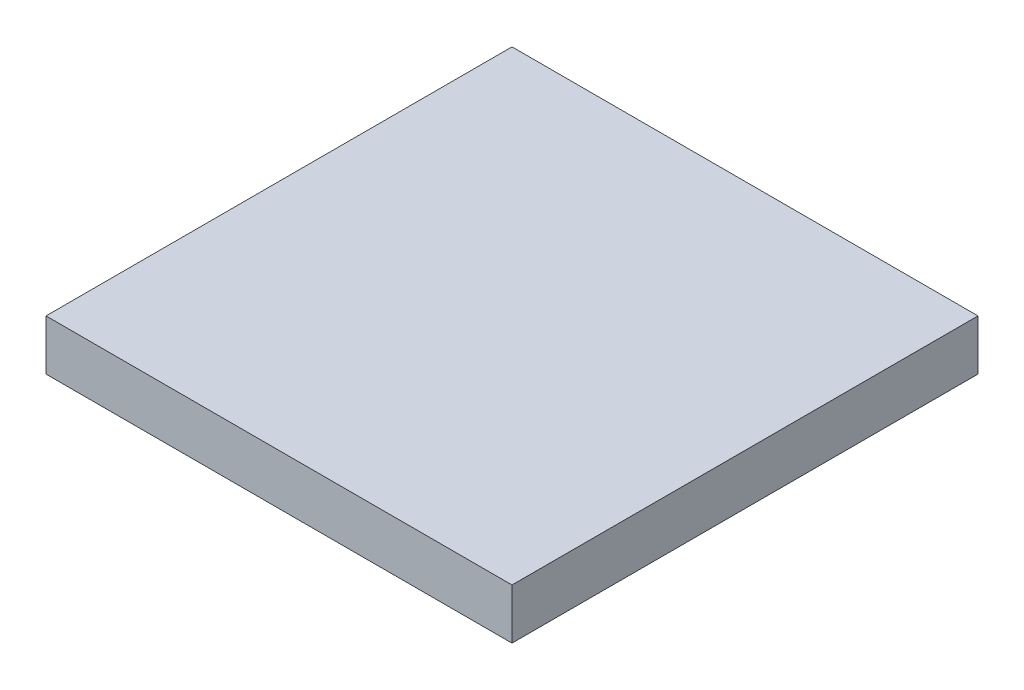
ISO-10303-21;
HEADER;
FILE_DESCRIPTION(('STEP AP214'),'2;1');
FILE_NAME('part.step','',(''),(''),'','','');
FILE_SCHEMA(('AUTOMOTIVE_DESIGN { 1 0 10303 214 1 1 1 1 }'));
ENDSEC;
DATA;
#1=APPLICATION_CONTEXT('core data for automotive mechanical design processes');
#2=APPLICATION_PROTOCOL_DEFINITION('international standard','automotive_design',2000,#1);
#3=PRODUCT_CONTEXT('',#1,'mechanical');
#4=PRODUCT('Part','Part','',(#3));
#5=PRODUCT_RELATED_PRODUCT_CATEGORY('part','',(#4));
#6=PRODUCT_DEFINITION_FORMATION('','',#4);
#7=PRODUCT_DEFINITION_CONTEXT('part definition',#1,'design');
#8=PRODUCT_DEFINITION('design','',#6,#7);
#9=PRODUCT_DEFINITION_SHAPE('','',#8);
#10=(LENGTH_UNIT() NAMED_UNIT(*) SI_UNIT(.MILLI.,.METRE.));
#11=(NAMED_UNIT(*) PLANE_ANGLE_UNIT() SI_UNIT($,.RADIAN.));
#12=(NAMED_UNIT(*) SI_UNIT($,.STERADIAN.) SOLID_ANGLE_UNIT());
#13=UNCERTAINTY_MEASURE_WITH_UNIT(LENGTH_MEASURE(1.E-05),#10,'distance_accuracy_value','');
#14=(GEOMETRIC_REPRESENTATION_CONTEXT(3) GLOBAL_UNCERTAINTY_ASSIGNED_CONTEXT((#13)) GLOBAL_UNIT_ASSIGNED_CONTEXT((#10,
#11,#12)) REPRESENTATION_CONTEXT('',''));
#15=CARTESIAN_POINT('',(0.,0.,0.));
#16=DIRECTION('',(0.,0.,1.));
#17=DIRECTION('',(1.,0.,0.));
#18=AXIS2_PLACEMENT_3D('',#15,#16,#17);
#19=CARTESIAN_POINT('',(0.,5.15,0.));
#20=DIRECTION('',(1.,0.,0.));
#21=DIRECTION('',(0.,0.,-1.));
#22=AXIS2_PLACEMENT_3D('',#19,#20,#21);
#23=PLANE('',#22);
#24=DIRECTION('',(0.,0.,1.));
#25=VECTOR('',#24,1.);
#26=CARTESIAN_POINT('',(0.,0.,0.));
#27=LINE('',#26,#25);
#28=CARTESIAN_POINT('',(0.,0.,-47.625));
#29=VERTEX_POINT('',#28);
#30=CARTESIAN_POINT('',(0.,0.,0.));
#31=VERTEX_POINT('',#30);
#32=EDGE_CURVE('E100',#29,#31,#27,.T.);
#33=ORIENTED_EDGE('',*,*,#32,.T.);
#34=DIRECTION('',(0.,-1.,0.));
#35=VECTOR('',#34,1.);
#36=CARTESIAN_POINT('',(0.,5.15,0.));
#37=LINE('',#36,#35);
#38=CARTESIAN_POINT('',(0.,5.15,0.));
#39=VERTEX_POINT('',#38);
#40=EDGE_CURVE('E11',#39,#31,#37,.T.);
#41=ORIENTED_EDGE('',*,*,#40,.F.);
#42=DIRECTION('',(0.,0.,1.));
#43=VECTOR('',#42,1.);
#44=CARTESIAN_POINT('',(0.,5.15,0.));
#45=LINE('',#44,#43);
#46=CARTESIAN_POINT('',(0.,5.15,-47.625));
#47=VERTEX_POINT('',#46);
#48=EDGE_CURVE('E88',#47,#39,#45,.T.);
#49=ORIENTED_EDGE('',*,*,#48,.F.);
#50=DIRECTION('',(0.,-1.,0.));
#51=VECTOR('',#50,1.);
#52=CARTESIAN_POINT('',(0.,5.15,-47.625));
#53=LINE('',#52,#51);
#54=EDGE_CURVE('E96',#47,#29,#53,.T.);
#55=ORIENTED_EDGE('',*,*,#54,.T.);
#56=EDGE_LOOP('',(#33,#41,#49,#55));
#57=FACE_BOUND('',#56,.T.);
#58=ADVANCED_FACE('F37',(#57),#23,.F.);
#59=CARTESIAN_POINT('',(0.,5.15,0.));
#60=DIRECTION('',(0.,0.,-1.));
#61=DIRECTION('',(-1.,0.,0.));
#62=AXIS2_PLACEMENT_3D('',#59,#60,#61);
#63=PLANE('',#62);
#64=DIRECTION('',(1.,0.,0.));
#65=VECTOR('',#64,1.);
#66=CARTESIAN_POINT('',(0.,0.,0.));
#67=LINE('',#66,#65);
#68=CARTESIAN_POINT('',(47.625,0.,0.));
#69=VERTEX_POINT('',#68);
#70=EDGE_CURVE('E92',#31,#69,#67,.T.);
#71=ORIENTED_EDGE('',*,*,#70,.T.);
#72=DIRECTION('',(0.,-1.,0.));
#73=VECTOR('',#72,1.);
#74=CARTESIAN_POINT('',(47.625,5.15,0.));
#75=LINE('',#74,#73);
#76=CARTESIAN_POINT('',(47.625,5.15,0.));
#77=VERTEX_POINT('',#76);
#78=EDGE_CURVE('E45',#77,#69,#75,.T.);
#79=ORIENTED_EDGE('',*,*,#78,.F.);
#80=DIRECTION('',(1.,0.,0.));
#81=VECTOR('',#80,1.);
#82=CARTESIAN_POINT('',(0.,5.15,0.));
#83=LINE('',#82,#81);
#84=EDGE_CURVE('E83',#39,#77,#83,.T.);
#85=ORIENTED_EDGE('',*,*,#84,.F.);
#86=ORIENTED_EDGE('',*,*,#40,.T.);
#87=EDGE_LOOP('',(#71,#79,#85,#86));
#88=FACE_BOUND('',#87,.T.);
#89=ADVANCED_FACE('F91',(#88),#63,.F.);
#90=CARTESIAN_POINT('',(47.625,5.15,0.));
#91=DIRECTION('',(-1.,0.,0.));
#92=DIRECTION('',(0.,0.,1.));
#93=AXIS2_PLACEMENT_3D('',#90,#91,#92);
#94=PLANE('',#93);
#95=DIRECTION('',(0.,0.,-1.));
#96=VECTOR('',#95,1.);
#97=CARTESIAN_POINT('',(47.625,0.,0.));
#98=LINE('',#97,#96);
#99=CARTESIAN_POINT('',(47.625,0.,-47.625));
#100=VERTEX_POINT('',#99);
#101=EDGE_CURVE('E70',#69,#100,#98,.T.);
#102=ORIENTED_EDGE('',*,*,#101,.T.);
#103=DIRECTION('',(0.,-1.,0.));
#104=VECTOR('',#103,1.);
#105=CARTESIAN_POINT('',(47.625,5.15,-47.625));
#106=LINE('',#105,#104);
#107=CARTESIAN_POINT('',(47.625,5.15,-47.625));
#108=VERTEX_POINT('',#107);
#109=EDGE_CURVE('E93',#108,#100,#106,.T.);
#110=ORIENTED_EDGE('',*,*,#109,.F.);
#111=DIRECTION('',(0.,0.,-1.));
#112=VECTOR('',#111,1.);
#113=CARTESIAN_POINT('',(47.625,5.15,0.));
#114=LINE('',#113,#112);
#115=EDGE_CURVE('E86',#77,#108,#114,.T.);
#116=ORIENTED_EDGE('',*,*,#115,.F.);
#117=ORIENTED_EDGE('',*,*,#78,.T.);
#118=EDGE_LOOP('',(#102,#110,#116,#117));
#119=FACE_BOUND('',#118,.T.);
#120=ADVANCED_FACE('F94',(#119),#94,.F.);
#121=CARTESIAN_POINT('',(0.,5.15,-47.625));
#122=DIRECTION('',(0.,0.,1.));
#123=DIRECTION('',(1.,0.,0.));
#124=AXIS2_PLACEMENT_3D('',#121,#122,#123);
#125=PLANE('',#124);
#126=DIRECTION('',(-1.,0.,0.));
#127=VECTOR('',#126,1.);
#128=CARTESIAN_POINT('',(0.,0.,-47.625));
#129=LINE('',#128,#127);
#130=EDGE_CURVE('E76',#100,#29,#129,.T.);
#131=ORIENTED_EDGE('',*,*,#130,.T.);
#132=ORIENTED_EDGE('',*,*,#54,.F.);
#133=DIRECTION('',(-1.,0.,0.));
#134=VECTOR('',#133,1.);
#135=CARTESIAN_POINT('',(0.,5.15,-47.625));
#136=LINE('',#135,#134);
#137=EDGE_CURVE('E53',#108,#47,#136,.T.);
#138=ORIENTED_EDGE('',*,*,#137,.F.);
#139=ORIENTED_EDGE('',*,*,#109,.T.);
#140=EDGE_LOOP('',(#131,#132,#138,#139));
#141=FACE_BOUND('',#140,.T.);
#142=ADVANCED_FACE('F107',(#141),#125,.F.);
#143=CARTESIAN_POINT('',(0.,5.15,0.));
#144=DIRECTION('',(0.,-1.,0.));
#145=DIRECTION('',(0.,0.,-1.));
#146=AXIS2_PLACEMENT_3D('',#143,#144,#145);
#147=PLANE('',#146);
#148=ORIENTED_EDGE('',*,*,#48,.T.);
#149=ORIENTED_EDGE('',*,*,#84,.T.);
#150=ORIENTED_EDGE('',*,*,#115,.T.);
#151=ORIENTED_EDGE('',*,*,#137,.T.);
#152=EDGE_LOOP('',(#148,#149,#150,#151));
#153=FACE_BOUND('',#152,.T.);
#154=ADVANCED_FACE('F84',(#153),#147,.F.);
#155=CARTESIAN_POINT('',(0.,0.,0.));
#156=DIRECTION('',(0.,-1.,0.));
#157=DIRECTION('',(0.,0.,-1.));
#158=AXIS2_PLACEMENT_3D('',#155,#156,#157);
#159=PLANE('',#158);
#160=ORIENTED_EDGE('',*,*,#32,.F.);
#161=ORIENTED_EDGE('',*,*,#130,.F.);
#162=ORIENTED_EDGE('',*,*,#101,.F.);
#163=ORIENTED_EDGE('',*,*,#70,.F.);
#164=EDGE_LOOP('',(#160,#161,#162,#163));
#165=FACE_BOUND('',#164,.T.);
#166=ADVANCED_FACE('F110',(#165),#159,.T.);
#167=CLOSED_SHELL('',(#58,#89,#120,#142,#154,#166));
#168=MANIFOLD_SOLID_BREP('B2',#167);
#169=ADVANCED_BREP_SHAPE_REPRESENTATION('',(#18,#168),#14);
#170=SHAPE_DEFINITION_REPRESENTATION(#9,#169);
ENDSEC;
END-ISO-10303-21;
